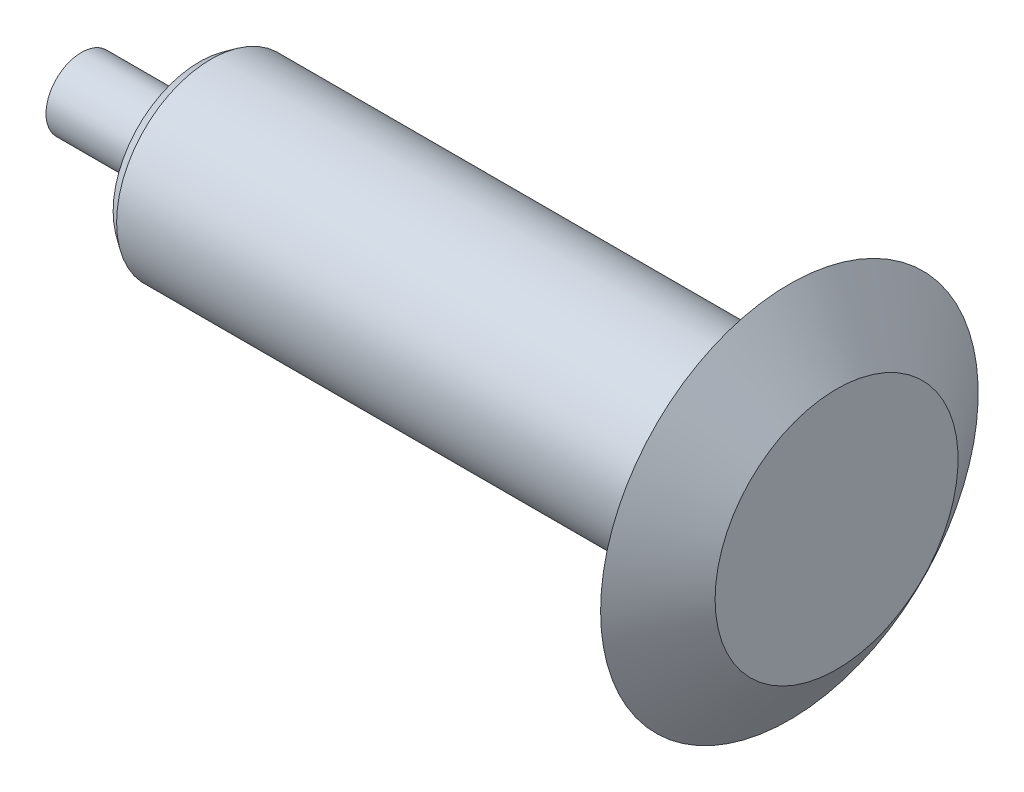
ISO-10303-21;
HEADER;
FILE_DESCRIPTION(('STEP AP214'),'2;1');
FILE_NAME('part.step','',(''),(''),'','','');
FILE_SCHEMA(('AUTOMOTIVE_DESIGN { 1 0 10303 214 1 1 1 1 }'));
ENDSEC;
DATA;
#1=APPLICATION_CONTEXT('core data for automotive mechanical design processes');
#2=APPLICATION_PROTOCOL_DEFINITION('international standard','automotive_design',2000,#1);
#3=PRODUCT_CONTEXT('',#1,'mechanical');
#4=PRODUCT('Part','Part','',(#3));
#5=PRODUCT_RELATED_PRODUCT_CATEGORY('part','',(#4));
#6=PRODUCT_DEFINITION_FORMATION('','',#4);
#7=PRODUCT_DEFINITION_CONTEXT('part definition',#1,'design');
#8=PRODUCT_DEFINITION('design','',#6,#7);
#9=PRODUCT_DEFINITION_SHAPE('','',#8);
#10=(LENGTH_UNIT() NAMED_UNIT(*) SI_UNIT(.MILLI.,.METRE.));
#11=(NAMED_UNIT(*) PLANE_ANGLE_UNIT() SI_UNIT($,.RADIAN.));
#12=(NAMED_UNIT(*) SI_UNIT($,.STERADIAN.) SOLID_ANGLE_UNIT());
#13=UNCERTAINTY_MEASURE_WITH_UNIT(LENGTH_MEASURE(1.E-05),#10,'distance_accuracy_value','');
#14=(GEOMETRIC_REPRESENTATION_CONTEXT(3) GLOBAL_UNCERTAINTY_ASSIGNED_CONTEXT((#13)) GLOBAL_UNIT_ASSIGNED_CONTEXT((#10,
#11,#12)) REPRESENTATION_CONTEXT('',''));
#15=CARTESIAN_POINT('',(0.,0.,0.));
#16=DIRECTION('',(0.,0.,1.));
#17=DIRECTION('',(1.,0.,0.));
#18=AXIS2_PLACEMENT_3D('',#15,#16,#17);
#19=CARTESIAN_POINT('',(0.,0.,0.));
#20=DIRECTION('',(-1.,0.,0.));
#21=DIRECTION('',(0.,0.,1.));
#22=AXIS2_PLACEMENT_3D('',#19,#20,#21);
#23=PLANE('',#22);
#24=CARTESIAN_POINT('',(0.,0.,0.));
#25=DIRECTION('',(-1.,0.,0.));
#26=DIRECTION('',(0.,0.,1.));
#27=AXIS2_PLACEMENT_3D('',#24,#25,#26);
#28=CIRCLE('',#27,25.7421333368156);
#29=CARTESIAN_POINT('',(0.,0.,25.7421333368156));
#30=VERTEX_POINT('',#29);
#31=EDGE_CURVE('E10',#30,#30,#28,.T.);
#32=ORIENTED_EDGE('',*,*,#31,.F.);
#33=EDGE_LOOP('',(#32));
#34=FACE_BOUND('',#33,.T.);
#35=ADVANCED_FACE('F37',(#34),#23,.F.);
#36=CARTESIAN_POINT('',(0.,0.,0.));
#37=DIRECTION('',(-1.,0.,0.));
#38=DIRECTION('',(0.,0.,1.));
#39=AXIS2_PLACEMENT_3D('',#36,#37,#38);
#40=CONICAL_SURFACE('',#39,25.7421333368156,0.959153368682097);
#41=CARTESIAN_POINT('',(-10.,0.,0.));
#42=DIRECTION('',(-1.,0.,0.));
#43=DIRECTION('',(0.,0.,1.));
#44=AXIS2_PLACEMENT_3D('',#41,#42,#43);
#45=CIRCLE('',#44,40.);
#46=CARTESIAN_POINT('',(-10.,0.,40.));
#47=VERTEX_POINT('',#46);
#48=EDGE_CURVE('E44',#47,#47,#45,.T.);
#49=ORIENTED_EDGE('',*,*,#48,.F.);
#50=EDGE_LOOP('',(#49));
#51=FACE_BOUND('',#50,.T.);
#52=ORIENTED_EDGE('',*,*,#31,.T.);
#53=EDGE_LOOP('',(#52));
#54=FACE_BOUND('',#53,.T.);
#55=ADVANCED_FACE('F111',(#51,#54),#40,.T.);
#56=CARTESIAN_POINT('',(-10.,40.,0.));
#57=DIRECTION('',(1.,0.,0.));
#58=DIRECTION('',(0.,0.,-1.));
#59=AXIS2_PLACEMENT_3D('',#56,#57,#58);
#60=PLANE('',#59);
#61=CARTESIAN_POINT('',(-10.,0.,0.));
#62=DIRECTION('',(-1.,0.,0.));
#63=DIRECTION('',(0.,0.,1.));
#64=AXIS2_PLACEMENT_3D('',#61,#62,#63);
#65=CIRCLE('',#64,25.7421333368156);
#66=CARTESIAN_POINT('',(-10.,0.,25.7421333368156));
#67=VERTEX_POINT('',#66);
#68=EDGE_CURVE('E49',#67,#67,#65,.T.);
#69=ORIENTED_EDGE('',*,*,#68,.F.);
#70=EDGE_LOOP('',(#69));
#71=FACE_BOUND('',#70,.T.);
#72=ORIENTED_EDGE('',*,*,#48,.T.);
#73=EDGE_LOOP('',(#72));
#74=FACE_BOUND('',#73,.T.);
#75=ADVANCED_FACE('F106',(#71,#74),#60,.F.);
#76=CARTESIAN_POINT('',(-10.,0.,0.));
#77=DIRECTION('',(1.,0.,0.));
#78=DIRECTION('',(0.,0.,-1.));
#79=AXIS2_PLACEMENT_3D('',#76,#77,#78);
#80=CONICAL_SURFACE('',#79,25.7421333368156,0.611642958112799);
#81=CARTESIAN_POINT('',(-18.1870571478543,0.,0.));
#82=DIRECTION('',(-1.,0.,0.));
#83=DIRECTION('',(0.,0.,1.));
#84=AXIS2_PLACEMENT_3D('',#81,#82,#83);
#85=CIRCLE('',#84,20.);
#86=CARTESIAN_POINT('',(-18.1870571478543,0.,20.));
#87=VERTEX_POINT('',#86);
#88=EDGE_CURVE('E54',#87,#87,#85,.T.);
#89=ORIENTED_EDGE('',*,*,#88,.F.);
#90=EDGE_LOOP('',(#89));
#91=FACE_BOUND('',#90,.T.);
#92=ORIENTED_EDGE('',*,*,#68,.T.);
#93=EDGE_LOOP('',(#92));
#94=FACE_BOUND('',#93,.T.);
#95=ADVANCED_FACE('F100',(#91,#94),#80,.T.);
#96=CARTESIAN_POINT('',(-160.,0.,0.));
#97=DIRECTION('',(-1.,0.,0.));
#98=DIRECTION('',(0.,0.,1.));
#99=AXIS2_PLACEMENT_3D('',#96,#97,#98);
#100=CYLINDRICAL_SURFACE('',#99,20.);
#101=CARTESIAN_POINT('',(-132.543882855644,0.,0.));
#102=DIRECTION('',(-1.,0.,0.));
#103=DIRECTION('',(0.,0.,1.));
#104=AXIS2_PLACEMENT_3D('',#101,#102,#103);
#105=CIRCLE('',#104,20.);
#106=CARTESIAN_POINT('',(-132.543882855644,0.,20.));
#107=VERTEX_POINT('',#106);
#108=EDGE_CURVE('E60',#107,#107,#105,.T.);
#109=ORIENTED_EDGE('',*,*,#108,.F.);
#110=EDGE_LOOP('',(#109));
#111=FACE_BOUND('',#110,.T.);
#112=ORIENTED_EDGE('',*,*,#88,.T.);
#113=EDGE_LOOP('',(#112));
#114=FACE_BOUND('',#113,.T.);
#115=ADVANCED_FACE('F94',(#111,#114),#100,.T.);
#116=CARTESIAN_POINT('',(-132.543882855644,0.,0.));
#117=DIRECTION('',(1.,0.,0.));
#118=DIRECTION('',(0.,0.,-1.));
#119=AXIS2_PLACEMENT_3D('',#116,#117,#118);
#120=CONICAL_SURFACE('',#119,20.,0.6116429581128);
#121=CARTESIAN_POINT('',(-135.,0.,0.));
#122=DIRECTION('',(-1.,0.,0.));
#123=DIRECTION('',(0.,0.,1.));
#124=AXIS2_PLACEMENT_3D('',#121,#122,#123);
#125=CIRCLE('',#124,18.2773599989553);
#126=CARTESIAN_POINT('',(-135.,0.,18.2773599989553));
#127=VERTEX_POINT('',#126);
#128=EDGE_CURVE('E64',#127,#127,#125,.T.);
#129=ORIENTED_EDGE('',*,*,#128,.F.);
#130=EDGE_LOOP('',(#129));
#131=FACE_BOUND('',#130,.T.);
#132=ORIENTED_EDGE('',*,*,#108,.T.);
#133=EDGE_LOOP('',(#132));
#134=FACE_BOUND('',#133,.T.);
#135=ADVANCED_FACE('F88',(#131,#134),#120,.T.);
#136=CARTESIAN_POINT('',(-135.,18.2773599989553,0.));
#137=DIRECTION('',(1.,0.,0.));
#138=DIRECTION('',(0.,0.,-1.));
#139=AXIS2_PLACEMENT_3D('',#136,#137,#138);
#140=PLANE('',#139);
#141=CARTESIAN_POINT('',(-135.,0.,0.));
#142=DIRECTION('',(-1.,0.,0.));
#143=DIRECTION('',(0.,0.,1.));
#144=AXIS2_PLACEMENT_3D('',#141,#142,#143);
#145=CIRCLE('',#144,7.5);
#146=CARTESIAN_POINT('',(-135.,0.,7.5));
#147=VERTEX_POINT('',#146);
#148=EDGE_CURVE('E68',#147,#147,#145,.T.);
#149=ORIENTED_EDGE('',*,*,#148,.F.);
#150=EDGE_LOOP('',(#149));
#151=FACE_BOUND('',#150,.T.);
#152=ORIENTED_EDGE('',*,*,#128,.T.);
#153=EDGE_LOOP('',(#152));
#154=FACE_BOUND('',#153,.T.);
#155=ADVANCED_FACE('F82',(#151,#154),#140,.F.);
#156=CARTESIAN_POINT('',(-160.,0.,0.));
#157=DIRECTION('',(-1.,0.,0.));
#158=DIRECTION('',(0.,0.,1.));
#159=AXIS2_PLACEMENT_3D('',#156,#157,#158);
#160=CYLINDRICAL_SURFACE('',#159,7.5);
#161=CARTESIAN_POINT('',(-160.,0.,0.));
#162=DIRECTION('',(-1.,0.,0.));
#163=DIRECTION('',(0.,0.,1.));
#164=AXIS2_PLACEMENT_3D('',#161,#162,#163);
#165=CIRCLE('',#164,7.5);
#166=CARTESIAN_POINT('',(-160.,0.,7.5));
#167=VERTEX_POINT('',#166);
#168=EDGE_CURVE('E72',#167,#167,#165,.T.);
#169=ORIENTED_EDGE('',*,*,#168,.F.);
#170=EDGE_LOOP('',(#169));
#171=FACE_BOUND('',#170,.T.);
#172=ORIENTED_EDGE('',*,*,#148,.T.);
#173=EDGE_LOOP('',(#172));
#174=FACE_BOUND('',#173,.T.);
#175=ADVANCED_FACE('F79',(#171,#174),#160,.T.);
#176=CARTESIAN_POINT('',(-160.,7.5,0.));
#177=DIRECTION('',(1.,0.,0.));
#178=DIRECTION('',(0.,0.,-1.));
#179=AXIS2_PLACEMENT_3D('',#176,#177,#178);
#180=PLANE('',#179);
#181=ORIENTED_EDGE('',*,*,#168,.T.);
#182=EDGE_LOOP('',(#181));
#183=FACE_BOUND('',#182,.T.);
#184=ADVANCED_FACE('F77',(#183),#180,.F.);
#185=CLOSED_SHELL('',(#35,#55,#75,#95,#115,#135,#155,#175,#184));
#186=MANIFOLD_SOLID_BREP('B2',#185);
#187=ADVANCED_BREP_SHAPE_REPRESENTATION('',(#18,#186),#14);
#188=SHAPE_DEFINITION_REPRESENTATION(#9,#187);
ENDSEC;
END-ISO-10303-21;
